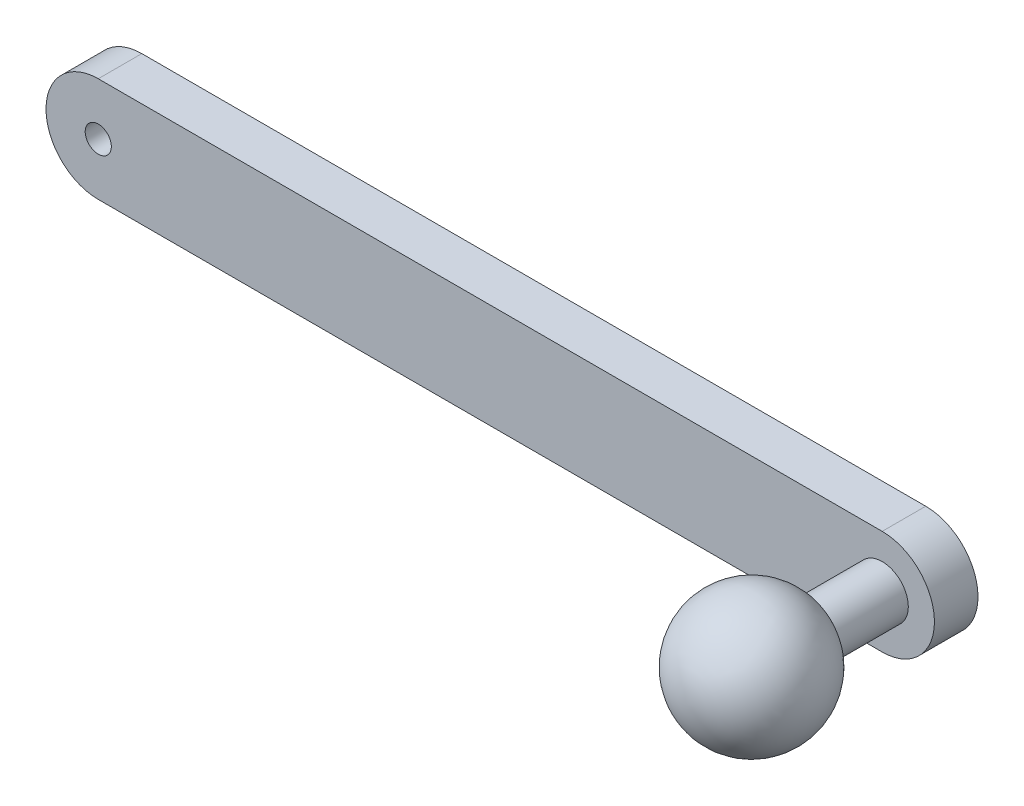
ISO-10303-21;
HEADER;
FILE_DESCRIPTION(('STEP AP214'),'2;1');
FILE_NAME('part.step','',(''),(''),'','','');
FILE_SCHEMA(('AUTOMOTIVE_DESIGN { 1 0 10303 214 1 1 1 1 }'));
ENDSEC;
DATA;
#1=APPLICATION_CONTEXT('core data for automotive mechanical design processes');
#2=APPLICATION_PROTOCOL_DEFINITION('international standard','automotive_design',2000,#1);
#3=PRODUCT_CONTEXT('',#1,'mechanical');
#4=PRODUCT('Part','Part','',(#3));
#5=PRODUCT_RELATED_PRODUCT_CATEGORY('part','',(#4));
#6=PRODUCT_DEFINITION_FORMATION('','',#4);
#7=PRODUCT_DEFINITION_CONTEXT('part definition',#1,'design');
#8=PRODUCT_DEFINITION('design','',#6,#7);
#9=PRODUCT_DEFINITION_SHAPE('','',#8);
#10=(LENGTH_UNIT() NAMED_UNIT(*) SI_UNIT(.MILLI.,.METRE.));
#11=(NAMED_UNIT(*) PLANE_ANGLE_UNIT() SI_UNIT($,.RADIAN.));
#12=(NAMED_UNIT(*) SI_UNIT($,.STERADIAN.) SOLID_ANGLE_UNIT());
#13=UNCERTAINTY_MEASURE_WITH_UNIT(LENGTH_MEASURE(1.E-05),#10,'distance_accuracy_value','');
#14=(GEOMETRIC_REPRESENTATION_CONTEXT(3) GLOBAL_UNCERTAINTY_ASSIGNED_CONTEXT((#13)) GLOBAL_UNIT_ASSIGNED_CONTEXT((#10,
#11,#12)) REPRESENTATION_CONTEXT('',''));
#15=CARTESIAN_POINT('',(0.,0.,0.));
#16=DIRECTION('',(0.,0.,1.));
#17=DIRECTION('',(1.,0.,0.));
#18=AXIS2_PLACEMENT_3D('',#15,#16,#17);
#19=CARTESIAN_POINT('',(90.,0.,20.));
#20=DIRECTION('',(0.,0.,-1.));
#21=DIRECTION('',(-1.,0.,0.));
#22=AXIS2_PLACEMENT_3D('',#19,#20,#21);
#23=CYLINDRICAL_SURFACE('',#22,3.00000000000001);
#24=CARTESIAN_POINT('',(90.,0.,5.));
#25=DIRECTION('',(0.,0.,1.));
#26=DIRECTION('',(1.,0.,0.));
#27=AXIS2_PLACEMENT_3D('',#24,#25,#26);
#28=CIRCLE('',#27,3.00000000000001);
#29=CARTESIAN_POINT('',(93.,0.,5.));
#30=VERTEX_POINT('',#29);
#31=EDGE_CURVE('E107',#30,#30,#28,.F.);
#32=ORIENTED_EDGE('',*,*,#31,.F.);
#33=EDGE_LOOP('',(#32));
#34=FACE_BOUND('',#33,.T.);
#35=CARTESIAN_POINT('',(90.,0.,13.1261364575662));
#36=DIRECTION('',(0.,0.,1.));
#37=DIRECTION('',(1.,0.,0.));
#38=AXIS2_PLACEMENT_3D('',#35,#36,#37);
#39=CIRCLE('',#38,3.00000000000001);
#40=CARTESIAN_POINT('',(93.,0.,13.1261364575662));
#41=VERTEX_POINT('',#40);
#42=EDGE_CURVE('E11',#41,#41,#39,.T.);
#43=ORIENTED_EDGE('',*,*,#42,.F.);
#44=EDGE_LOOP('',(#43));
#45=FACE_BOUND('',#44,.T.);
#46=ADVANCED_FACE('F34',(#34,#45),#23,.T.);
#47=CARTESIAN_POINT('',(0.,-6.,5.));
#48=DIRECTION('',(0.,1.,0.));
#49=DIRECTION('',(-1.,0.,0.));
#50=AXIS2_PLACEMENT_3D('',#47,#48,#49);
#51=PLANE('',#50);
#52=DIRECTION('',(1.,0.,0.));
#53=VECTOR('',#52,1.);
#54=CARTESIAN_POINT('',(0.,-6.,0.));
#55=LINE('',#54,#53);
#56=CARTESIAN_POINT('',(0.,-6.,0.));
#57=VERTEX_POINT('',#56);
#58=CARTESIAN_POINT('',(90.,-6.,0.));
#59=VERTEX_POINT('',#58);
#60=EDGE_CURVE('E104',#57,#59,#55,.T.);
#61=ORIENTED_EDGE('',*,*,#60,.T.);
#62=DIRECTION('',(0.,0.,-1.));
#63=VECTOR('',#62,1.);
#64=CARTESIAN_POINT('',(90.,-6.,5.));
#65=LINE('',#64,#63);
#66=CARTESIAN_POINT('',(90.,-6.,5.));
#67=VERTEX_POINT('',#66);
#68=EDGE_CURVE('E43',#67,#59,#65,.T.);
#69=ORIENTED_EDGE('',*,*,#68,.F.);
#70=DIRECTION('',(1.,0.,0.));
#71=VECTOR('',#70,1.);
#72=CARTESIAN_POINT('',(0.,-6.,5.));
#73=LINE('',#72,#71);
#74=CARTESIAN_POINT('',(0.,-6.,5.));
#75=VERTEX_POINT('',#74);
#76=EDGE_CURVE('E84',#75,#67,#73,.T.);
#77=ORIENTED_EDGE('',*,*,#76,.F.);
#78=DIRECTION('',(0.,0.,-1.));
#79=VECTOR('',#78,1.);
#80=CARTESIAN_POINT('',(0.,-6.,5.));
#81=LINE('',#80,#79);
#82=EDGE_CURVE('E103',#75,#57,#81,.T.);
#83=ORIENTED_EDGE('',*,*,#82,.T.);
#84=EDGE_LOOP('',(#61,#69,#77,#83));
#85=FACE_BOUND('',#84,.T.);
#86=ADVANCED_FACE('F36',(#85),#51,.F.);
#87=CARTESIAN_POINT('',(90.,0.,5.));
#88=DIRECTION('',(0.,0.,-1.));
#89=DIRECTION('',(-1.,0.,0.));
#90=AXIS2_PLACEMENT_3D('',#87,#88,#89);
#91=CYLINDRICAL_SURFACE('',#90,6.);
#92=CARTESIAN_POINT('',(90.,0.,0.));
#93=DIRECTION('',(0.,0.,1.));
#94=DIRECTION('',(1.,0.,0.));
#95=AXIS2_PLACEMENT_3D('',#92,#93,#94);
#96=CIRCLE('',#95,6.);
#97=CARTESIAN_POINT('',(90.,6.,0.));
#98=VERTEX_POINT('',#97);
#99=EDGE_CURVE('E90',#59,#98,#96,.T.);
#100=ORIENTED_EDGE('',*,*,#99,.T.);
#101=DIRECTION('',(0.,0.,-1.));
#102=VECTOR('',#101,1.);
#103=CARTESIAN_POINT('',(90.,6.,5.));
#104=LINE('',#103,#102);
#105=CARTESIAN_POINT('',(90.,6.,5.));
#106=VERTEX_POINT('',#105);
#107=EDGE_CURVE('E88',#106,#98,#104,.T.);
#108=ORIENTED_EDGE('',*,*,#107,.F.);
#109=CARTESIAN_POINT('',(90.,0.,5.));
#110=DIRECTION('',(0.,0.,1.));
#111=DIRECTION('',(1.,0.,0.));
#112=AXIS2_PLACEMENT_3D('',#109,#110,#111);
#113=CIRCLE('',#112,6.);
#114=EDGE_CURVE('E78',#67,#106,#113,.T.);
#115=ORIENTED_EDGE('',*,*,#114,.F.);
#116=ORIENTED_EDGE('',*,*,#68,.T.);
#117=EDGE_LOOP('',(#100,#108,#115,#116));
#118=FACE_BOUND('',#117,.T.);
#119=ADVANCED_FACE('F89',(#118),#91,.T.);
#120=CARTESIAN_POINT('',(0.,6.,5.));
#121=DIRECTION('',(0.,1.,0.));
#122=DIRECTION('',(-1.,0.,0.));
#123=AXIS2_PLACEMENT_3D('',#120,#121,#122);
#124=PLANE('',#123);
#125=DIRECTION('',(1.,0.,0.));
#126=VECTOR('',#125,1.);
#127=CARTESIAN_POINT('',(0.,6.,0.));
#128=LINE('',#127,#126);
#129=CARTESIAN_POINT('',(0.,6.,0.));
#130=VERTEX_POINT('',#129);
#131=EDGE_CURVE('E109',#130,#98,#128,.T.);
#132=ORIENTED_EDGE('',*,*,#131,.F.);
#133=DIRECTION('',(0.,0.,-1.));
#134=VECTOR('',#133,1.);
#135=CARTESIAN_POINT('',(0.,6.,5.));
#136=LINE('',#135,#134);
#137=CARTESIAN_POINT('',(0.,6.,5.));
#138=VERTEX_POINT('',#137);
#139=EDGE_CURVE('E67',#138,#130,#136,.T.);
#140=ORIENTED_EDGE('',*,*,#139,.F.);
#141=DIRECTION('',(1.,0.,0.));
#142=VECTOR('',#141,1.);
#143=CARTESIAN_POINT('',(0.,6.,5.));
#144=LINE('',#143,#142);
#145=EDGE_CURVE('E82',#138,#106,#144,.T.);
#146=ORIENTED_EDGE('',*,*,#145,.T.);
#147=ORIENTED_EDGE('',*,*,#107,.T.);
#148=EDGE_LOOP('',(#132,#140,#146,#147));
#149=FACE_BOUND('',#148,.T.);
#150=ADVANCED_FACE('F95',(#149),#124,.T.);
#151=CARTESIAN_POINT('',(0.,0.,5.));
#152=DIRECTION('',(0.,0.,-1.));
#153=DIRECTION('',(-1.,0.,0.));
#154=AXIS2_PLACEMENT_3D('',#151,#152,#153);
#155=CYLINDRICAL_SURFACE('',#154,1.5);
#156=CARTESIAN_POINT('',(0.,0.,5.));
#157=DIRECTION('',(0.,0.,1.));
#158=DIRECTION('',(1.,0.,0.));
#159=AXIS2_PLACEMENT_3D('',#156,#157,#158);
#160=CIRCLE('',#159,1.5);
#161=CARTESIAN_POINT('',(1.5,0.,5.));
#162=VERTEX_POINT('',#161);
#163=EDGE_CURVE('E97',#162,#162,#160,.T.);
#164=ORIENTED_EDGE('',*,*,#163,.T.);
#165=EDGE_LOOP('',(#164));
#166=FACE_BOUND('',#165,.T.);
#167=CARTESIAN_POINT('',(0.,0.,0.));
#168=DIRECTION('',(0.,0.,1.));
#169=DIRECTION('',(1.,0.,0.));
#170=AXIS2_PLACEMENT_3D('',#167,#168,#169);
#171=CIRCLE('',#170,1.5);
#172=CARTESIAN_POINT('',(1.5,0.,0.));
#173=VERTEX_POINT('',#172);
#174=EDGE_CURVE('E112',#173,#173,#171,.T.);
#175=ORIENTED_EDGE('',*,*,#174,.F.);
#176=EDGE_LOOP('',(#175));
#177=FACE_BOUND('',#176,.T.);
#178=ADVANCED_FACE('F126',(#166,#177),#155,.F.);
#179=CARTESIAN_POINT('',(0.,0.,5.));
#180=DIRECTION('',(0.,0.,-1.));
#181=DIRECTION('',(-1.,0.,0.));
#182=AXIS2_PLACEMENT_3D('',#179,#180,#181);
#183=CYLINDRICAL_SURFACE('',#182,6.);
#184=CARTESIAN_POINT('',(0.,0.,0.));
#185=DIRECTION('',(0.,0.,1.));
#186=DIRECTION('',(1.,0.,0.));
#187=AXIS2_PLACEMENT_3D('',#184,#185,#186);
#188=CIRCLE('',#187,6.);
#189=EDGE_CURVE('E70',#130,#57,#188,.T.);
#190=ORIENTED_EDGE('',*,*,#189,.T.);
#191=ORIENTED_EDGE('',*,*,#82,.F.);
#192=CARTESIAN_POINT('',(0.,0.,5.));
#193=DIRECTION('',(0.,0.,1.));
#194=DIRECTION('',(1.,0.,0.));
#195=AXIS2_PLACEMENT_3D('',#192,#193,#194);
#196=CIRCLE('',#195,6.);
#197=EDGE_CURVE('E51',#138,#75,#196,.T.);
#198=ORIENTED_EDGE('',*,*,#197,.F.);
#199=ORIENTED_EDGE('',*,*,#139,.T.);
#200=EDGE_LOOP('',(#190,#191,#198,#199));
#201=FACE_BOUND('',#200,.T.);
#202=ADVANCED_FACE('F128',(#201),#183,.T.);
#203=CARTESIAN_POINT('',(0.,0.,5.));
#204=DIRECTION('',(0.,0.,1.));
#205=DIRECTION('',(1.,0.,0.));
#206=AXIS2_PLACEMENT_3D('',#203,#204,#205);
#207=PLANE('',#206);
#208=ORIENTED_EDGE('',*,*,#31,.T.);
#209=EDGE_LOOP('',(#208));
#210=FACE_BOUND('',#209,.T.);
#211=ORIENTED_EDGE('',*,*,#76,.T.);
#212=ORIENTED_EDGE('',*,*,#114,.T.);
#213=ORIENTED_EDGE('',*,*,#145,.F.);
#214=ORIENTED_EDGE('',*,*,#197,.T.);
#215=EDGE_LOOP('',(#211,#212,#213,#214));
#216=FACE_BOUND('',#215,.T.);
#217=ORIENTED_EDGE('',*,*,#163,.F.);
#218=EDGE_LOOP('',(#217));
#219=FACE_BOUND('',#218,.T.);
#220=ADVANCED_FACE('F79',(#210,#216,#219),#207,.T.);
#221=CARTESIAN_POINT('',(0.,0.,0.));
#222=DIRECTION('',(0.,0.,1.));
#223=DIRECTION('',(1.,0.,0.));
#224=AXIS2_PLACEMENT_3D('',#221,#222,#223);
#225=PLANE('',#224);
#226=ORIENTED_EDGE('',*,*,#60,.F.);
#227=ORIENTED_EDGE('',*,*,#189,.F.);
#228=ORIENTED_EDGE('',*,*,#131,.T.);
#229=ORIENTED_EDGE('',*,*,#99,.F.);
#230=EDGE_LOOP('',(#226,#227,#228,#229));
#231=FACE_BOUND('',#230,.T.);
#232=ORIENTED_EDGE('',*,*,#174,.T.);
#233=EDGE_LOOP('',(#232));
#234=FACE_BOUND('',#233,.T.);
#235=ADVANCED_FACE('F119',(#231,#234),#225,.F.);
#236=CARTESIAN_POINT('',(90.,0.,20.));
#237=DIRECTION('',(-1.,0.,0.));
#238=DIRECTION('',(0.,1.,0.));
#239=AXIS2_PLACEMENT_3D('',#236,#237,#238);
#240=SPHERICAL_SURFACE('',#239,7.50000000000001);
#241=CARTESIAN_POINT('',(90.,0.,20.));
#242=DIRECTION('',(0.,0.,1.));
#243=DIRECTION('',(1.,0.,0.));
#244=AXIS2_PLACEMENT_3D('',#241,#242,#243);
#245=SPHERICAL_SURFACE('',#244,7.50000000000001);
#246=ORIENTED_EDGE('',*,*,#42,.T.);
#247=EDGE_LOOP('',(#246));
#248=FACE_BOUND('',#247,.T.);
#249=ADVANCED_FACE('F122',(#248),#245,.T.);
#250=CLOSED_SHELL('',(#46,#86,#119,#150,#178,#202,#220,#235,#249));
#251=MANIFOLD_SOLID_BREP('B2',#250);
#252=ADVANCED_BREP_SHAPE_REPRESENTATION('',(#18,#251),#14);
#253=SHAPE_DEFINITION_REPRESENTATION(#9,#252);
ENDSEC;
END-ISO-10303-21;
